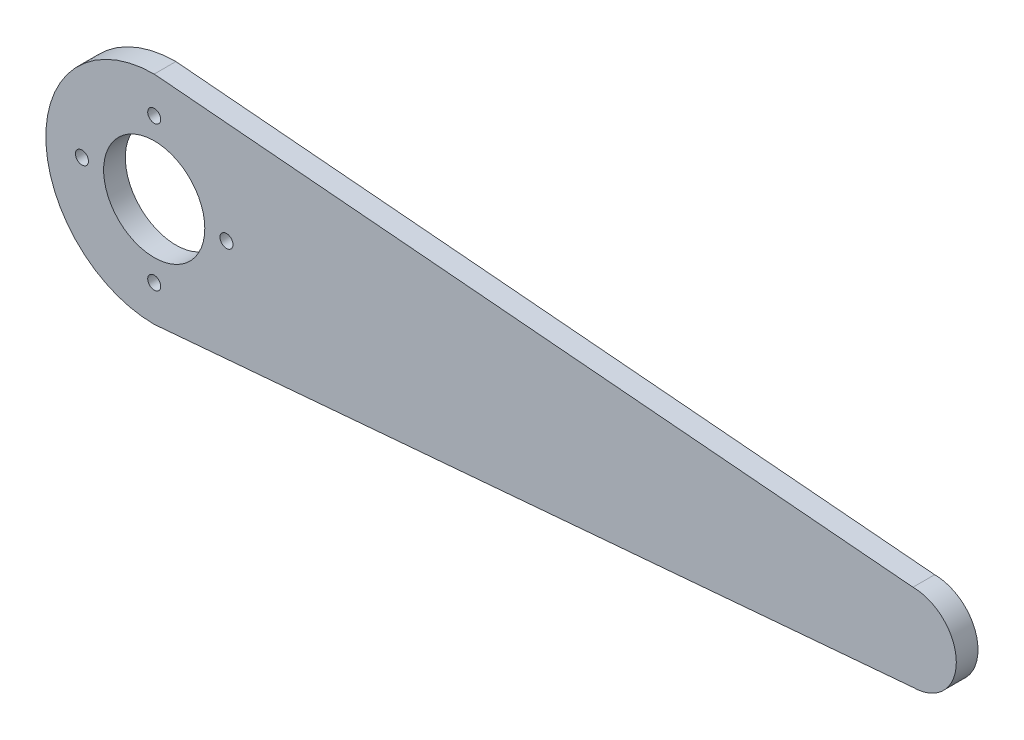
ISO-10303-21;
HEADER;
FILE_DESCRIPTION(('STEP AP214'),'2;1');
FILE_NAME('part.step','',(''),(''),'','','');
FILE_SCHEMA(('AUTOMOTIVE_DESIGN { 1 0 10303 214 1 1 1 1 }'));
ENDSEC;
DATA;
#1=APPLICATION_CONTEXT('core data for automotive mechanical design processes');
#2=APPLICATION_PROTOCOL_DEFINITION('international standard','automotive_design',2000,#1);
#3=PRODUCT_CONTEXT('',#1,'mechanical');
#4=PRODUCT('Part','Part','',(#3));
#5=PRODUCT_RELATED_PRODUCT_CATEGORY('part','',(#4));
#6=PRODUCT_DEFINITION_FORMATION('','',#4);
#7=PRODUCT_DEFINITION_CONTEXT('part definition',#1,'design');
#8=PRODUCT_DEFINITION('design','',#6,#7);
#9=PRODUCT_DEFINITION_SHAPE('','',#8);
#10=(LENGTH_UNIT() NAMED_UNIT(*) SI_UNIT(.MILLI.,.METRE.));
#11=(NAMED_UNIT(*) PLANE_ANGLE_UNIT() SI_UNIT($,.RADIAN.));
#12=(NAMED_UNIT(*) SI_UNIT($,.STERADIAN.) SOLID_ANGLE_UNIT());
#13=UNCERTAINTY_MEASURE_WITH_UNIT(LENGTH_MEASURE(1.E-05),#10,'distance_accuracy_value','');
#14=(GEOMETRIC_REPRESENTATION_CONTEXT(3) GLOBAL_UNCERTAINTY_ASSIGNED_CONTEXT((#13)) GLOBAL_UNIT_ASSIGNED_CONTEXT((#10,
#11,#12)) REPRESENTATION_CONTEXT('',''));
#15=CARTESIAN_POINT('',(0.,0.,0.));
#16=DIRECTION('',(0.,0.,1.));
#17=DIRECTION('',(1.,0.,0.));
#18=AXIS2_PLACEMENT_3D('',#15,#16,#17);
#19=CARTESIAN_POINT('',(1.27633711507293,-14.8905996758509,3.));
#20=DIRECTION('',(-0.0854011413464356,0.996346649041751,0.));
#21=DIRECTION('',(-0.996346649041751,-0.0854011413464356,0.));
#22=AXIS2_PLACEMENT_3D('',#19,#20,#21);
#23=PLANE('',#22);
#24=DIRECTION('',(0.996346649041751,0.0854011413464357,0.));
#25=VECTOR('',#24,1.);
#26=CARTESIAN_POINT('',(1.27633711507293,-14.8905996758509,0.));
#27=LINE('',#26,#25);
#28=CARTESIAN_POINT('',(0.,-15.,0.));
#29=VERTEX_POINT('',#28);
#30=CARTESIAN_POINT('',(105.,-6.00000000000002,0.));
#31=VERTEX_POINT('',#30);
#32=EDGE_CURVE('E113',#29,#31,#27,.T.);
#33=ORIENTED_EDGE('',*,*,#32,.T.);
#34=DIRECTION('',(0.,0.,-1.));
#35=VECTOR('',#34,1.);
#36=CARTESIAN_POINT('',(105.,-6.00000000000002,3.));
#37=LINE('',#36,#35);
#38=CARTESIAN_POINT('',(105.,-6.00000000000002,3.));
#39=VERTEX_POINT('',#38);
#40=EDGE_CURVE('E11',#39,#31,#37,.T.);
#41=ORIENTED_EDGE('',*,*,#40,.F.);
#42=DIRECTION('',(0.996346649041751,0.0854011413464357,0.));
#43=VECTOR('',#42,1.);
#44=CARTESIAN_POINT('',(1.27633711507293,-14.8905996758509,3.));
#45=LINE('',#44,#43);
#46=CARTESIAN_POINT('',(0.,-15.,3.));
#47=VERTEX_POINT('',#46);
#48=EDGE_CURVE('E83',#47,#39,#45,.T.);
#49=ORIENTED_EDGE('',*,*,#48,.F.);
#50=DIRECTION('',(0.,0.,-1.));
#51=VECTOR('',#50,1.);
#52=CARTESIAN_POINT('',(0.,-15.,3.));
#53=LINE('',#52,#51);
#54=EDGE_CURVE('E112',#47,#29,#53,.T.);
#55=ORIENTED_EDGE('',*,*,#54,.T.);
#56=EDGE_LOOP('',(#33,#41,#49,#55));
#57=FACE_BOUND('',#56,.T.);
#58=ADVANCED_FACE('F35',(#57),#23,.F.);
#59=CARTESIAN_POINT('',(105.,0.,3.));
#60=DIRECTION('',(0.,0.,-1.));
#61=DIRECTION('',(-1.,0.,0.));
#62=AXIS2_PLACEMENT_3D('',#59,#60,#61);
#63=CYLINDRICAL_SURFACE('',#62,6.00000000000002);
#64=CARTESIAN_POINT('',(105.,0.,0.));
#65=DIRECTION('',(0.,0.,1.));
#66=DIRECTION('',(1.,0.,0.));
#67=AXIS2_PLACEMENT_3D('',#64,#65,#66);
#68=CIRCLE('',#67,6.00000000000002);
#69=CARTESIAN_POINT('',(105.,6.00000000000002,0.));
#70=VERTEX_POINT('',#69);
#71=EDGE_CURVE('E88',#31,#70,#68,.T.);
#72=ORIENTED_EDGE('',*,*,#71,.T.);
#73=DIRECTION('',(0.,0.,-1.));
#74=VECTOR('',#73,1.);
#75=CARTESIAN_POINT('',(105.,6.00000000000002,3.));
#76=LINE('',#75,#74);
#77=CARTESIAN_POINT('',(105.,6.00000000000002,3.));
#78=VERTEX_POINT('',#77);
#79=EDGE_CURVE('E43',#78,#70,#76,.T.);
#80=ORIENTED_EDGE('',*,*,#79,.F.);
#81=CARTESIAN_POINT('',(105.,0.,3.));
#82=DIRECTION('',(0.,0.,1.));
#83=DIRECTION('',(1.,0.,0.));
#84=AXIS2_PLACEMENT_3D('',#81,#82,#83);
#85=CIRCLE('',#84,6.00000000000002);
#86=EDGE_CURVE('E77',#39,#78,#85,.T.);
#87=ORIENTED_EDGE('',*,*,#86,.F.);
#88=ORIENTED_EDGE('',*,*,#40,.T.);
#89=EDGE_LOOP('',(#72,#80,#87,#88));
#90=FACE_BOUND('',#89,.T.);
#91=ADVANCED_FACE('F87',(#90),#63,.T.);
#92=CARTESIAN_POINT('',(1.27633711507293,14.8905996758509,3.));
#93=DIRECTION('',(0.0854011413464356,0.996346649041751,0.));
#94=DIRECTION('',(-0.996346649041751,0.0854011413464356,0.));
#95=AXIS2_PLACEMENT_3D('',#92,#93,#94);
#96=PLANE('',#95);
#97=DIRECTION('',(0.996346649041751,-0.0854011413464357,0.));
#98=VECTOR('',#97,1.);
#99=CARTESIAN_POINT('',(1.27633711507293,14.8905996758509,0.));
#100=LINE('',#99,#98);
#101=CARTESIAN_POINT('',(0.,15.,0.));
#102=VERTEX_POINT('',#101);
#103=EDGE_CURVE('E117',#102,#70,#100,.T.);
#104=ORIENTED_EDGE('',*,*,#103,.F.);
#105=DIRECTION('',(0.,0.,-1.));
#106=VECTOR('',#105,1.);
#107=CARTESIAN_POINT('',(0.,15.,3.));
#108=LINE('',#107,#106);
#109=CARTESIAN_POINT('',(0.,15.,3.));
#110=VERTEX_POINT('',#109);
#111=EDGE_CURVE('E67',#110,#102,#108,.T.);
#112=ORIENTED_EDGE('',*,*,#111,.F.);
#113=DIRECTION('',(0.996346649041751,-0.0854011413464357,0.));
#114=VECTOR('',#113,1.);
#115=CARTESIAN_POINT('',(1.27633711507293,14.8905996758509,3.));
#116=LINE('',#115,#114);
#117=EDGE_CURVE('E81',#110,#78,#116,.T.);
#118=ORIENTED_EDGE('',*,*,#117,.T.);
#119=ORIENTED_EDGE('',*,*,#79,.T.);
#120=EDGE_LOOP('',(#104,#112,#118,#119));
#121=FACE_BOUND('',#120,.T.);
#122=ADVANCED_FACE('F92',(#121),#96,.T.);
#123=CARTESIAN_POINT('',(-10.,0.,3.));
#124=DIRECTION('',(0.,0.,-1.));
#125=DIRECTION('',(-1.,0.,0.));
#126=AXIS2_PLACEMENT_3D('',#123,#124,#125);
#127=CYLINDRICAL_SURFACE('',#126,0.9);
#128=CARTESIAN_POINT('',(-10.,0.,3.));
#129=DIRECTION('',(0.,0.,1.));
#130=DIRECTION('',(1.,0.,0.));
#131=AXIS2_PLACEMENT_3D('',#128,#129,#130);
#132=CIRCLE('',#131,0.9);
#133=CARTESIAN_POINT('',(-9.1,0.,3.));
#134=VERTEX_POINT('',#133);
#135=EDGE_CURVE('E106',#134,#134,#132,.T.);
#136=ORIENTED_EDGE('',*,*,#135,.T.);
#137=EDGE_LOOP('',(#136));
#138=FACE_BOUND('',#137,.T.);
#139=CARTESIAN_POINT('',(-10.,0.,0.));
#140=DIRECTION('',(0.,0.,1.));
#141=DIRECTION('',(1.,0.,0.));
#142=AXIS2_PLACEMENT_3D('',#139,#140,#141);
#143=CIRCLE('',#142,0.9);
#144=CARTESIAN_POINT('',(-9.1,0.,0.));
#145=VERTEX_POINT('',#144);
#146=EDGE_CURVE('E129',#145,#145,#143,.T.);
#147=ORIENTED_EDGE('',*,*,#146,.F.);
#148=EDGE_LOOP('',(#147));
#149=FACE_BOUND('',#148,.T.);
#150=ADVANCED_FACE('F173',(#138,#149),#127,.F.);
#151=CARTESIAN_POINT('',(0.,10.,3.));
#152=DIRECTION('',(0.,0.,-1.));
#153=DIRECTION('',(-1.,0.,0.));
#154=AXIS2_PLACEMENT_3D('',#151,#152,#153);
#155=CYLINDRICAL_SURFACE('',#154,0.9);
#156=CARTESIAN_POINT('',(0.,10.,3.));
#157=DIRECTION('',(0.,0.,1.));
#158=DIRECTION('',(1.,0.,0.));
#159=AXIS2_PLACEMENT_3D('',#156,#157,#158);
#160=CIRCLE('',#159,0.9);
#161=CARTESIAN_POINT('',(0.900000000000069,10.,3.));
#162=VERTEX_POINT('',#161);
#163=EDGE_CURVE('E103',#162,#162,#160,.T.);
#164=ORIENTED_EDGE('',*,*,#163,.T.);
#165=EDGE_LOOP('',(#164));
#166=FACE_BOUND('',#165,.T.);
#167=CARTESIAN_POINT('',(0.,10.,0.));
#168=DIRECTION('',(0.,0.,1.));
#169=DIRECTION('',(1.,0.,0.));
#170=AXIS2_PLACEMENT_3D('',#167,#168,#169);
#171=CIRCLE('',#170,0.9);
#172=CARTESIAN_POINT('',(0.900000000000069,10.,0.));
#173=VERTEX_POINT('',#172);
#174=EDGE_CURVE('E126',#173,#173,#171,.T.);
#175=ORIENTED_EDGE('',*,*,#174,.F.);
#176=EDGE_LOOP('',(#175));
#177=FACE_BOUND('',#176,.T.);
#178=ADVANCED_FACE('F182',(#166,#177),#155,.F.);
#179=CARTESIAN_POINT('',(10.,-1.05254516842123E-13,3.));
#180=DIRECTION('',(0.,0.,-1.));
#181=DIRECTION('',(-1.,0.,0.));
#182=AXIS2_PLACEMENT_3D('',#179,#180,#181);
#183=CYLINDRICAL_SURFACE('',#182,0.9);
#184=CARTESIAN_POINT('',(10.,-1.05254516842123E-13,3.));
#185=DIRECTION('',(0.,0.,1.));
#186=DIRECTION('',(1.,0.,0.));
#187=AXIS2_PLACEMENT_3D('',#184,#185,#186);
#188=CIRCLE('',#187,0.9);
#189=CARTESIAN_POINT('',(10.9,-1.05254516842123E-13,3.));
#190=VERTEX_POINT('',#189);
#191=EDGE_CURVE('E100',#190,#190,#188,.T.);
#192=ORIENTED_EDGE('',*,*,#191,.T.);
#193=EDGE_LOOP('',(#192));
#194=FACE_BOUND('',#193,.T.);
#195=CARTESIAN_POINT('',(10.,-1.05254516842123E-13,0.));
#196=DIRECTION('',(0.,0.,1.));
#197=DIRECTION('',(1.,0.,0.));
#198=AXIS2_PLACEMENT_3D('',#195,#196,#197);
#199=CIRCLE('',#198,0.9);
#200=CARTESIAN_POINT('',(10.9,-1.05254516842123E-13,0.));
#201=VERTEX_POINT('',#200);
#202=EDGE_CURVE('E123',#201,#201,#199,.T.);
#203=ORIENTED_EDGE('',*,*,#202,.F.);
#204=EDGE_LOOP('',(#203));
#205=FACE_BOUND('',#204,.T.);
#206=ADVANCED_FACE('F178',(#194,#205),#183,.F.);
#207=CARTESIAN_POINT('',(0.,0.,3.));
#208=DIRECTION('',(0.,0.,-1.));
#209=DIRECTION('',(-1.,0.,0.));
#210=AXIS2_PLACEMENT_3D('',#207,#208,#209);
#211=CYLINDRICAL_SURFACE('',#210,7.);
#212=CARTESIAN_POINT('',(0.,0.,3.));
#213=DIRECTION('',(0.,0.,1.));
#214=DIRECTION('',(1.,0.,0.));
#215=AXIS2_PLACEMENT_3D('',#212,#213,#214);
#216=CIRCLE('',#215,7.);
#217=CARTESIAN_POINT('',(7.,0.,3.));
#218=VERTEX_POINT('',#217);
#219=EDGE_CURVE('E94',#218,#218,#216,.T.);
#220=ORIENTED_EDGE('',*,*,#219,.T.);
#221=EDGE_LOOP('',(#220));
#222=FACE_BOUND('',#221,.T.);
#223=CARTESIAN_POINT('',(0.,0.,0.));
#224=DIRECTION('',(0.,0.,1.));
#225=DIRECTION('',(1.,0.,0.));
#226=AXIS2_PLACEMENT_3D('',#223,#224,#225);
#227=CIRCLE('',#226,7.);
#228=CARTESIAN_POINT('',(7.,0.,0.));
#229=VERTEX_POINT('',#228);
#230=EDGE_CURVE('E120',#229,#229,#227,.T.);
#231=ORIENTED_EDGE('',*,*,#230,.F.);
#232=EDGE_LOOP('',(#231));
#233=FACE_BOUND('',#232,.T.);
#234=ADVANCED_FACE('F163',(#222,#233),#211,.F.);
#235=CARTESIAN_POINT('',(0.,0.,3.));
#236=DIRECTION('',(0.,0.,-1.));
#237=DIRECTION('',(-1.,0.,0.));
#238=AXIS2_PLACEMENT_3D('',#235,#236,#237);
#239=CYLINDRICAL_SURFACE('',#238,15.);
#240=CARTESIAN_POINT('',(0.,0.,0.));
#241=DIRECTION('',(0.,0.,1.));
#242=DIRECTION('',(1.,0.,0.));
#243=AXIS2_PLACEMENT_3D('',#240,#241,#242);
#244=CIRCLE('',#243,15.);
#245=EDGE_CURVE('E70',#102,#29,#244,.T.);
#246=ORIENTED_EDGE('',*,*,#245,.T.);
#247=ORIENTED_EDGE('',*,*,#54,.F.);
#248=CARTESIAN_POINT('',(0.,0.,3.));
#249=DIRECTION('',(0.,0.,1.));
#250=DIRECTION('',(1.,0.,0.));
#251=AXIS2_PLACEMENT_3D('',#248,#249,#250);
#252=CIRCLE('',#251,15.);
#253=EDGE_CURVE('E51',#110,#47,#252,.T.);
#254=ORIENTED_EDGE('',*,*,#253,.F.);
#255=ORIENTED_EDGE('',*,*,#111,.T.);
#256=EDGE_LOOP('',(#246,#247,#254,#255));
#257=FACE_BOUND('',#256,.T.);
#258=ADVANCED_FACE('F155',(#257),#239,.T.);
#259=CARTESIAN_POINT('',(0.,-10.,3.));
#260=DIRECTION('',(0.,0.,-1.));
#261=DIRECTION('',(-1.,0.,0.));
#262=AXIS2_PLACEMENT_3D('',#259,#260,#261);
#263=CYLINDRICAL_SURFACE('',#262,0.9);
#264=CARTESIAN_POINT('',(0.,-10.,3.));
#265=DIRECTION('',(0.,0.,1.));
#266=DIRECTION('',(1.,0.,0.));
#267=AXIS2_PLACEMENT_3D('',#264,#265,#266);
#268=CIRCLE('',#267,0.9);
#269=CARTESIAN_POINT('',(0.900000000000001,-10.,3.));
#270=VERTEX_POINT('',#269);
#271=EDGE_CURVE('E109',#270,#270,#268,.T.);
#272=ORIENTED_EDGE('',*,*,#271,.T.);
#273=EDGE_LOOP('',(#272));
#274=FACE_BOUND('',#273,.T.);
#275=CARTESIAN_POINT('',(0.,-10.,0.));
#276=DIRECTION('',(0.,0.,1.));
#277=DIRECTION('',(1.,0.,0.));
#278=AXIS2_PLACEMENT_3D('',#275,#276,#277);
#279=CIRCLE('',#278,0.9);
#280=CARTESIAN_POINT('',(0.900000000000001,-10.,0.));
#281=VERTEX_POINT('',#280);
#282=EDGE_CURVE('E132',#281,#281,#279,.T.);
#283=ORIENTED_EDGE('',*,*,#282,.F.);
#284=EDGE_LOOP('',(#283));
#285=FACE_BOUND('',#284,.T.);
#286=ADVANCED_FACE('F153',(#274,#285),#263,.F.);
#287=CARTESIAN_POINT('',(0.,0.,3.));
#288=DIRECTION('',(0.,0.,1.));
#289=DIRECTION('',(1.,0.,0.));
#290=AXIS2_PLACEMENT_3D('',#287,#288,#289);
#291=PLANE('',#290);
#292=ORIENTED_EDGE('',*,*,#48,.T.);
#293=ORIENTED_EDGE('',*,*,#86,.T.);
#294=ORIENTED_EDGE('',*,*,#117,.F.);
#295=ORIENTED_EDGE('',*,*,#253,.T.);
#296=EDGE_LOOP('',(#292,#293,#294,#295));
#297=FACE_BOUND('',#296,.T.);
#298=ORIENTED_EDGE('',*,*,#219,.F.);
#299=EDGE_LOOP('',(#298));
#300=FACE_BOUND('',#299,.T.);
#301=ORIENTED_EDGE('',*,*,#191,.F.);
#302=EDGE_LOOP('',(#301));
#303=FACE_BOUND('',#302,.T.);
#304=ORIENTED_EDGE('',*,*,#163,.F.);
#305=EDGE_LOOP('',(#304));
#306=FACE_BOUND('',#305,.T.);
#307=ORIENTED_EDGE('',*,*,#135,.F.);
#308=EDGE_LOOP('',(#307));
#309=FACE_BOUND('',#308,.T.);
#310=ORIENTED_EDGE('',*,*,#271,.F.);
#311=EDGE_LOOP('',(#310));
#312=FACE_BOUND('',#311,.T.);
#313=ADVANCED_FACE('F78',(#297,#300,#303,#306,#309,#312),#291,.T.);
#314=CARTESIAN_POINT('',(0.,0.,0.));
#315=DIRECTION('',(0.,0.,1.));
#316=DIRECTION('',(1.,0.,0.));
#317=AXIS2_PLACEMENT_3D('',#314,#315,#316);
#318=PLANE('',#317);
#319=ORIENTED_EDGE('',*,*,#32,.F.);
#320=ORIENTED_EDGE('',*,*,#245,.F.);
#321=ORIENTED_EDGE('',*,*,#103,.T.);
#322=ORIENTED_EDGE('',*,*,#71,.F.);
#323=EDGE_LOOP('',(#319,#320,#321,#322));
#324=FACE_BOUND('',#323,.T.);
#325=ORIENTED_EDGE('',*,*,#230,.T.);
#326=EDGE_LOOP('',(#325));
#327=FACE_BOUND('',#326,.T.);
#328=ORIENTED_EDGE('',*,*,#202,.T.);
#329=EDGE_LOOP('',(#328));
#330=FACE_BOUND('',#329,.T.);
#331=ORIENTED_EDGE('',*,*,#174,.T.);
#332=EDGE_LOOP('',(#331));
#333=FACE_BOUND('',#332,.T.);
#334=ORIENTED_EDGE('',*,*,#146,.T.);
#335=EDGE_LOOP('',(#334));
#336=FACE_BOUND('',#335,.T.);
#337=ORIENTED_EDGE('',*,*,#282,.T.);
#338=EDGE_LOOP('',(#337));
#339=FACE_BOUND('',#338,.T.);
#340=ADVANCED_FACE('F139',(#324,#327,#330,#333,#336,#339),#318,.F.);
#341=CLOSED_SHELL('',(#58,#91,#122,#150,#178,#206,#234,#258,#286,#313,#340));
#342=MANIFOLD_SOLID_BREP('B2',#341);
#343=ADVANCED_BREP_SHAPE_REPRESENTATION('',(#18,#342),#14);
#344=SHAPE_DEFINITION_REPRESENTATION(#9,#343);
ENDSEC;
END-ISO-10303-21;
